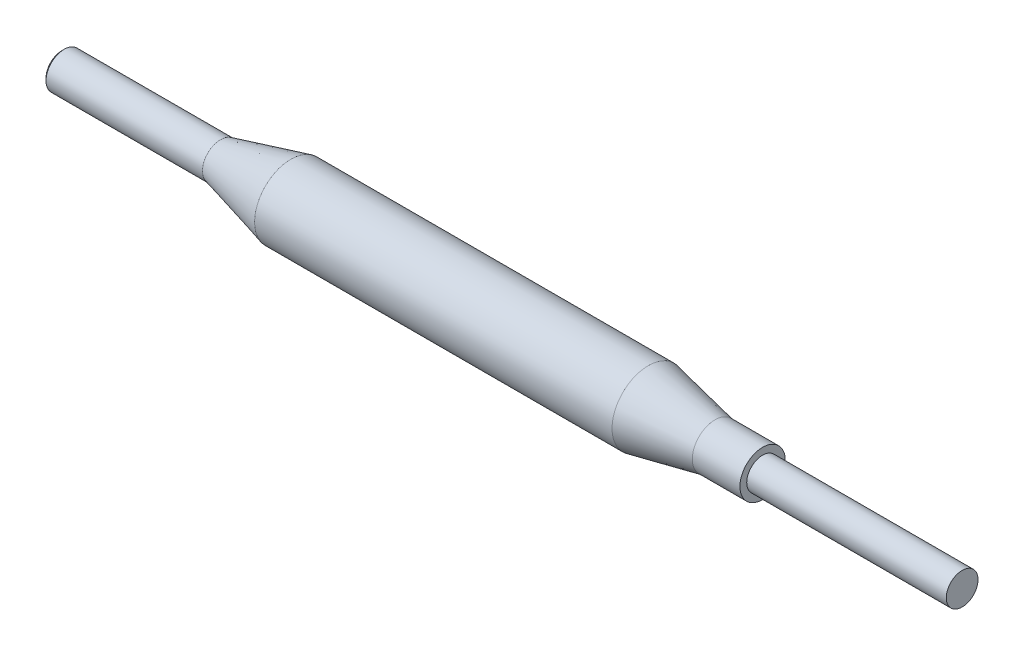
ISO-10303-21;
HEADER;
FILE_DESCRIPTION(('STEP AP214'),'2;1');
FILE_NAME('part.step','',(''),(''),'','','');
FILE_SCHEMA(('AUTOMOTIVE_DESIGN { 1 0 10303 214 1 1 1 1 }'));
ENDSEC;
DATA;
#1=APPLICATION_CONTEXT('core data for automotive mechanical design processes');
#2=APPLICATION_PROTOCOL_DEFINITION('international standard','automotive_design',2000,#1);
#3=PRODUCT_CONTEXT('',#1,'mechanical');
#4=PRODUCT('Part','Part','',(#3));
#5=PRODUCT_RELATED_PRODUCT_CATEGORY('part','',(#4));
#6=PRODUCT_DEFINITION_FORMATION('','',#4);
#7=PRODUCT_DEFINITION_CONTEXT('part definition',#1,'design');
#8=PRODUCT_DEFINITION('design','',#6,#7);
#9=PRODUCT_DEFINITION_SHAPE('','',#8);
#10=(LENGTH_UNIT() NAMED_UNIT(*) SI_UNIT(.MILLI.,.METRE.));
#11=(NAMED_UNIT(*) PLANE_ANGLE_UNIT() SI_UNIT($,.RADIAN.));
#12=(NAMED_UNIT(*) SI_UNIT($,.STERADIAN.) SOLID_ANGLE_UNIT());
#13=UNCERTAINTY_MEASURE_WITH_UNIT(LENGTH_MEASURE(1.E-05),#10,'distance_accuracy_value','');
#14=(GEOMETRIC_REPRESENTATION_CONTEXT(3) GLOBAL_UNCERTAINTY_ASSIGNED_CONTEXT((#13)) GLOBAL_UNIT_ASSIGNED_CONTEXT((#10,
#11,#12)) REPRESENTATION_CONTEXT('',''));
#15=CARTESIAN_POINT('',(0.,0.,0.));
#16=DIRECTION('',(0.,0.,1.));
#17=DIRECTION('',(1.,0.,0.));
#18=AXIS2_PLACEMENT_3D('',#15,#16,#17);
#19=CARTESIAN_POINT('',(0.,0.,0.));
#20=DIRECTION('',(1.,0.,0.));
#21=DIRECTION('',(0.,0.,-1.));
#22=AXIS2_PLACEMENT_3D('',#19,#20,#21);
#23=PLANE('',#22);
#24=CARTESIAN_POINT('',(0.,0.,0.));
#25=DIRECTION('',(1.,0.,0.));
#26=DIRECTION('',(0.,0.,-1.));
#27=AXIS2_PLACEMENT_3D('',#24,#25,#26);
#28=CIRCLE('',#27,3.49999999999998);
#29=CARTESIAN_POINT('',(0.,0.,-3.49999999999998));
#30=VERTEX_POINT('',#29);
#31=EDGE_CURVE('E41',#30,#30,#28,.F.);
#32=ORIENTED_EDGE('',*,*,#31,.T.);
#33=EDGE_LOOP('',(#32));
#34=FACE_BOUND('',#33,.T.);
#35=ADVANCED_FACE('F33',(#34),#23,.F.);
#36=CARTESIAN_POINT('',(0.,0.,0.));
#37=DIRECTION('',(-1.,0.,0.));
#38=DIRECTION('',(0.,0.,1.));
#39=AXIS2_PLACEMENT_3D('',#36,#37,#38);
#40=CYLINDRICAL_SURFACE('',#39,4.);
#41=CARTESIAN_POINT('',(0.500000000000011,0.,0.));
#42=DIRECTION('',(1.,0.,0.));
#43=DIRECTION('',(0.,0.,-1.));
#44=AXIS2_PLACEMENT_3D('',#41,#42,#43);
#45=CIRCLE('',#44,4.);
#46=CARTESIAN_POINT('',(0.500000000000011,0.,-4.));
#47=VERTEX_POINT('',#46);
#48=EDGE_CURVE('E10',#47,#47,#45,.T.);
#49=ORIENTED_EDGE('',*,*,#48,.T.);
#50=EDGE_LOOP('',(#49));
#51=FACE_BOUND('',#50,.T.);
#52=CARTESIAN_POINT('',(35.,0.,0.));
#53=DIRECTION('',(-1.,0.,0.));
#54=DIRECTION('',(0.,0.,1.));
#55=AXIS2_PLACEMENT_3D('',#52,#53,#54);
#56=CIRCLE('',#55,4.);
#57=CARTESIAN_POINT('',(35.,0.,4.));
#58=VERTEX_POINT('',#57);
#59=EDGE_CURVE('E45',#58,#58,#56,.T.);
#60=ORIENTED_EDGE('',*,*,#59,.T.);
#61=EDGE_LOOP('',(#60));
#62=FACE_BOUND('',#61,.T.);
#63=ADVANCED_FACE('F84',(#51,#62),#40,.T.);
#64=CARTESIAN_POINT('',(50.4919333848297,0.,0.));
#65=DIRECTION('',(1.,0.,0.));
#66=DIRECTION('',(0.,0.,-1.));
#67=AXIS2_PLACEMENT_3D('',#64,#65,#66);
#68=CONICAL_SURFACE('',#67,8.,0.252680255142079);
#69=ORIENTED_EDGE('',*,*,#59,.F.);
#70=EDGE_LOOP('',(#69));
#71=FACE_BOUND('',#70,.T.);
#72=CARTESIAN_POINT('',(50.4919333848297,0.,0.));
#73=DIRECTION('',(-1.,0.,0.));
#74=DIRECTION('',(0.,0.,1.));
#75=AXIS2_PLACEMENT_3D('',#72,#73,#74);
#76=CIRCLE('',#75,8.);
#77=CARTESIAN_POINT('',(50.4919333848297,0.,8.));
#78=VERTEX_POINT('',#77);
#79=EDGE_CURVE('E49',#78,#78,#76,.T.);
#80=ORIENTED_EDGE('',*,*,#79,.T.);
#81=EDGE_LOOP('',(#80));
#82=FACE_BOUND('',#81,.T.);
#83=ADVANCED_FACE('F88',(#71,#82),#68,.T.);
#84=CARTESIAN_POINT('',(0.,0.,0.));
#85=DIRECTION('',(-1.,0.,0.));
#86=DIRECTION('',(0.,0.,1.));
#87=AXIS2_PLACEMENT_3D('',#84,#85,#86);
#88=CYLINDRICAL_SURFACE('',#87,8.);
#89=ORIENTED_EDGE('',*,*,#79,.F.);
#90=EDGE_LOOP('',(#89));
#91=FACE_BOUND('',#90,.T.);
#92=CARTESIAN_POINT('',(129.303061543301,0.,0.));
#93=DIRECTION('',(-1.,0.,0.));
#94=DIRECTION('',(0.,0.,1.));
#95=AXIS2_PLACEMENT_3D('',#92,#93,#94);
#96=CIRCLE('',#95,8.);
#97=CARTESIAN_POINT('',(129.303061543301,0.,8.));
#98=VERTEX_POINT('',#97);
#99=EDGE_CURVE('E54',#98,#98,#96,.T.);
#100=ORIENTED_EDGE('',*,*,#99,.T.);
#101=EDGE_LOOP('',(#100));
#102=FACE_BOUND('',#101,.T.);
#103=ADVANCED_FACE('F93',(#91,#102),#88,.T.);
#104=CARTESIAN_POINT('',(144.,0.,0.));
#105=DIRECTION('',(-1.,0.,0.));
#106=DIRECTION('',(0.,0.,1.));
#107=AXIS2_PLACEMENT_3D('',#104,#105,#106);
#108=CONICAL_SURFACE('',#107,5.,0.201357920790331);
#109=ORIENTED_EDGE('',*,*,#99,.F.);
#110=EDGE_LOOP('',(#109));
#111=FACE_BOUND('',#110,.T.);
#112=CARTESIAN_POINT('',(144.,0.,0.));
#113=DIRECTION('',(-1.,0.,0.));
#114=DIRECTION('',(0.,0.,1.));
#115=AXIS2_PLACEMENT_3D('',#112,#113,#114);
#116=CIRCLE('',#115,5.);
#117=CARTESIAN_POINT('',(144.,0.,5.));
#118=VERTEX_POINT('',#117);
#119=EDGE_CURVE('E57',#118,#118,#116,.T.);
#120=ORIENTED_EDGE('',*,*,#119,.T.);
#121=EDGE_LOOP('',(#120));
#122=FACE_BOUND('',#121,.T.);
#123=ADVANCED_FACE('F97',(#111,#122),#108,.T.);
#124=CARTESIAN_POINT('',(0.,0.,0.));
#125=DIRECTION('',(-1.,0.,0.));
#126=DIRECTION('',(0.,0.,1.));
#127=AXIS2_PLACEMENT_3D('',#124,#125,#126);
#128=CYLINDRICAL_SURFACE('',#127,5.);
#129=ORIENTED_EDGE('',*,*,#119,.F.);
#130=EDGE_LOOP('',(#129));
#131=FACE_BOUND('',#130,.T.);
#132=CARTESIAN_POINT('',(154.5,0.,0.));
#133=DIRECTION('',(-1.,0.,0.));
#134=DIRECTION('',(0.,0.,1.));
#135=AXIS2_PLACEMENT_3D('',#132,#133,#134);
#136=CIRCLE('',#135,5.);
#137=CARTESIAN_POINT('',(154.5,0.,5.));
#138=VERTEX_POINT('',#137);
#139=EDGE_CURVE('E60',#138,#138,#136,.T.);
#140=ORIENTED_EDGE('',*,*,#139,.T.);
#141=EDGE_LOOP('',(#140));
#142=FACE_BOUND('',#141,.T.);
#143=ADVANCED_FACE('F101',(#131,#142),#128,.T.);
#144=CARTESIAN_POINT('',(154.5,5.,0.));
#145=DIRECTION('',(-1.,0.,0.));
#146=DIRECTION('',(0.,0.,1.));
#147=AXIS2_PLACEMENT_3D('',#144,#145,#146);
#148=PLANE('',#147);
#149=ORIENTED_EDGE('',*,*,#139,.F.);
#150=EDGE_LOOP('',(#149));
#151=FACE_BOUND('',#150,.T.);
#152=CARTESIAN_POINT('',(154.5,0.,0.));
#153=DIRECTION('',(-1.,0.,0.));
#154=DIRECTION('',(0.,0.,1.));
#155=AXIS2_PLACEMENT_3D('',#152,#153,#154);
#156=CIRCLE('',#155,3.5);
#157=CARTESIAN_POINT('',(154.5,0.,3.5));
#158=VERTEX_POINT('',#157);
#159=EDGE_CURVE('E63',#158,#158,#156,.T.);
#160=ORIENTED_EDGE('',*,*,#159,.T.);
#161=EDGE_LOOP('',(#160));
#162=FACE_BOUND('',#161,.T.);
#163=ADVANCED_FACE('F80',(#151,#162),#148,.F.);
#164=CARTESIAN_POINT('',(0.,0.,0.));
#165=DIRECTION('',(-1.,0.,0.));
#166=DIRECTION('',(0.,0.,1.));
#167=AXIS2_PLACEMENT_3D('',#164,#165,#166);
#168=CYLINDRICAL_SURFACE('',#167,3.5);
#169=ORIENTED_EDGE('',*,*,#159,.F.);
#170=EDGE_LOOP('',(#169));
#171=FACE_BOUND('',#170,.T.);
#172=CARTESIAN_POINT('',(198.5,0.,0.));
#173=DIRECTION('',(-1.,0.,0.));
#174=DIRECTION('',(0.,0.,1.));
#175=AXIS2_PLACEMENT_3D('',#172,#173,#174);
#176=CIRCLE('',#175,3.5);
#177=CARTESIAN_POINT('',(198.5,0.,3.5));
#178=VERTEX_POINT('',#177);
#179=EDGE_CURVE('E66',#178,#178,#176,.T.);
#180=ORIENTED_EDGE('',*,*,#179,.T.);
#181=EDGE_LOOP('',(#180));
#182=FACE_BOUND('',#181,.T.);
#183=ADVANCED_FACE('F70',(#171,#182),#168,.T.);
#184=CARTESIAN_POINT('',(198.5,3.5,0.));
#185=DIRECTION('',(-1.,0.,0.));
#186=DIRECTION('',(0.,0.,1.));
#187=AXIS2_PLACEMENT_3D('',#184,#185,#186);
#188=PLANE('',#187);
#189=ORIENTED_EDGE('',*,*,#179,.F.);
#190=EDGE_LOOP('',(#189));
#191=FACE_BOUND('',#190,.T.);
#192=ADVANCED_FACE('F72',(#191),#188,.F.);
#193=CARTESIAN_POINT('',(0.,0.,0.));
#194=DIRECTION('',(1.,0.,0.));
#195=DIRECTION('',(0.,0.,-1.));
#196=AXIS2_PLACEMENT_3D('',#193,#194,#195);
#197=CONICAL_SURFACE('',#196,3.49999999999998,0.785398163397462);
#198=ORIENTED_EDGE('',*,*,#48,.F.);
#199=EDGE_LOOP('',(#198));
#200=FACE_BOUND('',#199,.T.);
#201=ORIENTED_EDGE('',*,*,#31,.F.);
#202=EDGE_LOOP('',(#201));
#203=FACE_BOUND('',#202,.T.);
#204=ADVANCED_FACE('F36',(#200,#203),#197,.T.);
#205=CLOSED_SHELL('',(#35,#63,#83,#103,#123,#143,#163,#183,#192,#204));
#206=MANIFOLD_SOLID_BREP('B2',#205);
#207=ADVANCED_BREP_SHAPE_REPRESENTATION('',(#18,#206),#14);
#208=SHAPE_DEFINITION_REPRESENTATION(#9,#207);
ENDSEC;
END-ISO-10303-21;
